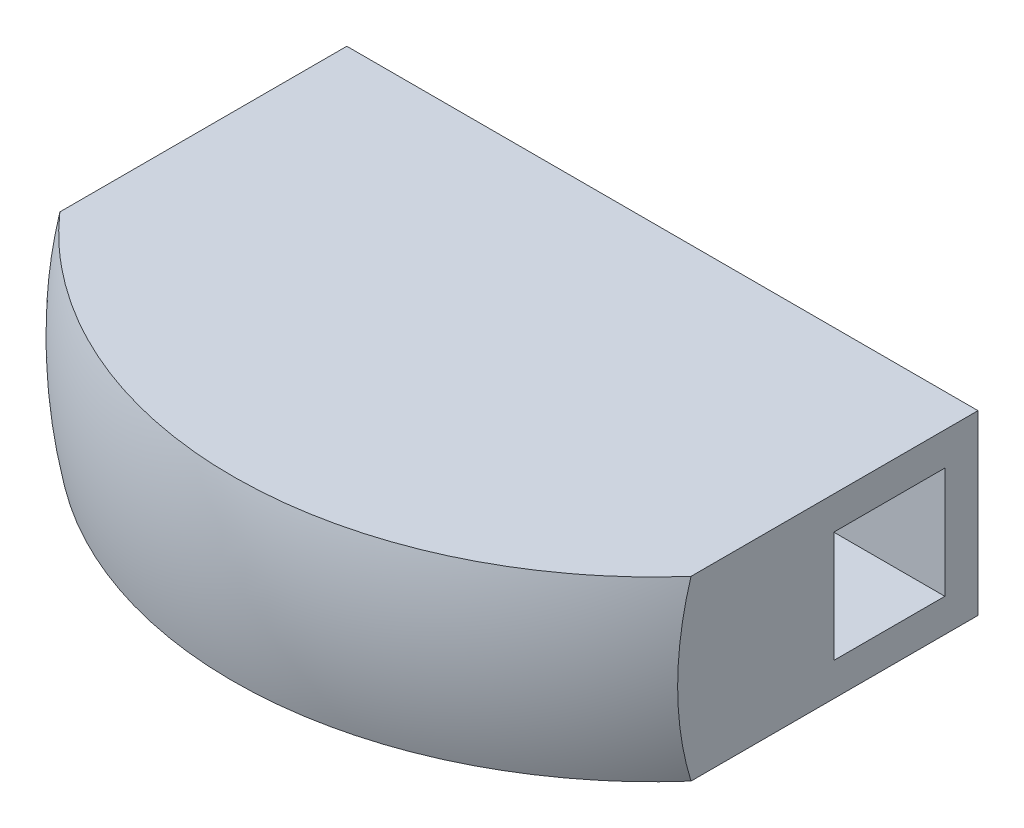
ISO-10303-21;
HEADER;
FILE_DESCRIPTION(('STEP AP214'),'2;1');
FILE_NAME('part.step','',(''),(''),'','','');
FILE_SCHEMA(('AUTOMOTIVE_DESIGN { 1 0 10303 214 1 1 1 1 }'));
ENDSEC;
DATA;
#1=APPLICATION_CONTEXT('core data for automotive mechanical design processes');
#2=APPLICATION_PROTOCOL_DEFINITION('international standard','automotive_design',2000,#1);
#3=PRODUCT_CONTEXT('',#1,'mechanical');
#4=PRODUCT('Part','Part','',(#3));
#5=PRODUCT_RELATED_PRODUCT_CATEGORY('part','',(#4));
#6=PRODUCT_DEFINITION_FORMATION('','',#4);
#7=PRODUCT_DEFINITION_CONTEXT('part definition',#1,'design');
#8=PRODUCT_DEFINITION('design','',#6,#7);
#9=PRODUCT_DEFINITION_SHAPE('','',#8);
#10=(LENGTH_UNIT() NAMED_UNIT(*) SI_UNIT(.MILLI.,.METRE.));
#11=(NAMED_UNIT(*) PLANE_ANGLE_UNIT() SI_UNIT($,.RADIAN.));
#12=(NAMED_UNIT(*) SI_UNIT($,.STERADIAN.) SOLID_ANGLE_UNIT());
#13=UNCERTAINTY_MEASURE_WITH_UNIT(LENGTH_MEASURE(1.E-05),#10,'distance_accuracy_value','');
#14=(GEOMETRIC_REPRESENTATION_CONTEXT(3) GLOBAL_UNCERTAINTY_ASSIGNED_CONTEXT((#13)) GLOBAL_UNIT_ASSIGNED_CONTEXT((#10,
#11,#12)) REPRESENTATION_CONTEXT('',''));
#15=CARTESIAN_POINT('',(0.,0.,0.));
#16=DIRECTION('',(0.,0.,1.));
#17=DIRECTION('',(1.,0.,0.));
#18=AXIS2_PLACEMENT_3D('',#15,#16,#17);
#19=CARTESIAN_POINT('',(9.525,0.,0.));
#20=DIRECTION('',(-1.,0.,0.));
#21=DIRECTION('',(0.,0.,1.));
#22=AXIS2_PLACEMENT_3D('',#19,#20,#21);
#23=PLANE('',#22);
#24=DIRECTION('',(0.,1.,0.));
#25=VECTOR('',#24,1.);
#26=CARTESIAN_POINT('',(9.525,-1.6764,-18.3231841816037));
#27=LINE('',#26,#25);
#28=CARTESIAN_POINT('',(9.525,-1.6764,-18.3231841816037));
#29=VERTEX_POINT('',#28);
#30=CARTESIAN_POINT('',(9.525,1.6764,-18.3231841816037));
#31=VERTEX_POINT('',#30);
#32=EDGE_CURVE('E197',#29,#31,#27,.T.);
#33=ORIENTED_EDGE('',*,*,#32,.F.);
#34=DIRECTION('',(0.,0.,-1.));
#35=VECTOR('',#34,1.);
#36=CARTESIAN_POINT('',(9.525,-1.6764,-14.9703841816037));
#37=LINE('',#36,#35);
#38=CARTESIAN_POINT('',(9.525,-1.6764,-14.9703841816037));
#39=VERTEX_POINT('',#38);
#40=EDGE_CURVE('E206',#39,#29,#37,.T.);
#41=ORIENTED_EDGE('',*,*,#40,.F.);
#42=DIRECTION('',(0.,-1.,0.));
#43=VECTOR('',#42,1.);
#44=CARTESIAN_POINT('',(9.525,-1.6764,-14.9703841816037));
#45=LINE('',#44,#43);
#46=CARTESIAN_POINT('',(9.525,1.6764,-14.9703841816037));
#47=VERTEX_POINT('',#46);
#48=EDGE_CURVE('E220',#47,#39,#45,.T.);
#49=ORIENTED_EDGE('',*,*,#48,.F.);
#50=DIRECTION('',(0.,0.,1.));
#51=VECTOR('',#50,1.);
#52=CARTESIAN_POINT('',(9.525,1.6764,-14.9703841816037));
#53=LINE('',#52,#51);
#54=EDGE_CURVE('E199',#31,#47,#53,.T.);
#55=ORIENTED_EDGE('',*,*,#54,.F.);
#56=EDGE_LOOP('',(#33,#41,#49,#55));
#57=FACE_BOUND('',#56,.T.);
#58=CARTESIAN_POINT('',(9.52500000000005,0.,-19.3231841816037));
#59=DIRECTION('',(1.,0.,0.));
#60=DIRECTION('',(0.,0.,-1.));
#61=AXIS2_PLACEMENT_3D('',#58,#59,#60);
#62=CIRCLE('',#61,9.06509971074134);
#63=CARTESIAN_POINT('',(9.52500000000005,2.6764,-10.662184481472));
#64=VERTEX_POINT('',#63);
#65=CARTESIAN_POINT('',(9.52500000000005,-2.6764,-10.662184481472));
#66=VERTEX_POINT('',#65);
#67=EDGE_CURVE('E105',#64,#66,#62,.T.);
#68=ORIENTED_EDGE('',*,*,#67,.T.);
#69=DIRECTION('',(0.,0.,-1.));
#70=VECTOR('',#69,1.);
#71=CARTESIAN_POINT('',(9.525,-2.6764,-13.9703841816037));
#72=LINE('',#71,#70);
#73=CARTESIAN_POINT('',(9.525,-2.6764,-19.3231841816037));
#74=VERTEX_POINT('',#73);
#75=EDGE_CURVE('E128',#66,#74,#72,.T.);
#76=ORIENTED_EDGE('',*,*,#75,.T.);
#77=DIRECTION('',(0.,1.,0.));
#78=VECTOR('',#77,1.);
#79=CARTESIAN_POINT('',(9.525,-2.6764,-19.3231841816037));
#80=LINE('',#79,#78);
#81=CARTESIAN_POINT('',(9.525,2.6764,-19.3231841816037));
#82=VERTEX_POINT('',#81);
#83=EDGE_CURVE('E125',#74,#82,#80,.T.);
#84=ORIENTED_EDGE('',*,*,#83,.T.);
#85=DIRECTION('',(0.,0.,1.));
#86=VECTOR('',#85,1.);
#87=CARTESIAN_POINT('',(9.525,2.6764,-13.9703841816037));
#88=LINE('',#87,#86);
#89=EDGE_CURVE('E118',#82,#64,#88,.T.);
#90=ORIENTED_EDGE('',*,*,#89,.T.);
#91=EDGE_LOOP('',(#68,#76,#84,#90));
#92=FACE_BOUND('',#91,.T.);
#93=ADVANCED_FACE('F40',(#57,#92),#23,.F.);
#94=CARTESIAN_POINT('',(-9.525,0.,0.));
#95=DIRECTION('',(-1.,0.,0.));
#96=DIRECTION('',(0.,0.,1.));
#97=AXIS2_PLACEMENT_3D('',#94,#95,#96);
#98=PLANE('',#97);
#99=DIRECTION('',(0.,0.,-1.));
#100=VECTOR('',#99,1.);
#101=CARTESIAN_POINT('',(-9.525,-1.6764,-14.9703841816037));
#102=LINE('',#101,#100);
#103=CARTESIAN_POINT('',(-9.525,-1.6764,-14.9703841816037));
#104=VERTEX_POINT('',#103);
#105=CARTESIAN_POINT('',(-9.525,-1.6764,-18.3231841816037));
#106=VERTEX_POINT('',#105);
#107=EDGE_CURVE('E192',#104,#106,#102,.T.);
#108=ORIENTED_EDGE('',*,*,#107,.T.);
#109=DIRECTION('',(0.,1.,0.));
#110=VECTOR('',#109,1.);
#111=CARTESIAN_POINT('',(-9.525,-1.6764,-18.3231841816037));
#112=LINE('',#111,#110);
#113=CARTESIAN_POINT('',(-9.525,1.6764,-18.3231841816037));
#114=VERTEX_POINT('',#113);
#115=EDGE_CURVE('E122',#106,#114,#112,.T.);
#116=ORIENTED_EDGE('',*,*,#115,.T.);
#117=DIRECTION('',(0.,0.,1.));
#118=VECTOR('',#117,1.);
#119=CARTESIAN_POINT('',(-9.525,1.6764,-14.9703841816037));
#120=LINE('',#119,#118);
#121=CARTESIAN_POINT('',(-9.525,1.6764,-14.9703841816037));
#122=VERTEX_POINT('',#121);
#123=EDGE_CURVE('E200',#114,#122,#120,.T.);
#124=ORIENTED_EDGE('',*,*,#123,.T.);
#125=DIRECTION('',(0.,-1.,0.));
#126=VECTOR('',#125,1.);
#127=CARTESIAN_POINT('',(-9.525,-1.6764,-14.9703841816037));
#128=LINE('',#127,#126);
#129=EDGE_CURVE('E195',#122,#104,#128,.T.);
#130=ORIENTED_EDGE('',*,*,#129,.T.);
#131=EDGE_LOOP('',(#108,#116,#124,#130));
#132=FACE_BOUND('',#131,.T.);
#133=DIRECTION('',(0.,0.,-1.));
#134=VECTOR('',#133,1.);
#135=CARTESIAN_POINT('',(-9.525,-2.6764,-13.9703841816037));
#136=LINE('',#135,#134);
#137=CARTESIAN_POINT('',(-9.525,-2.6764,-10.662184481472));
#138=VERTEX_POINT('',#137);
#139=CARTESIAN_POINT('',(-9.525,-2.6764,-19.3231841816037));
#140=VERTEX_POINT('',#139);
#141=EDGE_CURVE('E131',#138,#140,#136,.T.);
#142=ORIENTED_EDGE('',*,*,#141,.F.);
#143=CARTESIAN_POINT('',(-9.525,0.,-19.3231841816037));
#144=DIRECTION('',(1.,0.,0.));
#145=DIRECTION('',(0.,0.,-1.));
#146=AXIS2_PLACEMENT_3D('',#143,#144,#145);
#147=CIRCLE('',#146,9.06509971074129);
#148=CARTESIAN_POINT('',(-9.525,2.6764,-10.662184481472));
#149=VERTEX_POINT('',#148);
#150=EDGE_CURVE('E56',#149,#138,#147,.T.);
#151=ORIENTED_EDGE('',*,*,#150,.F.);
#152=DIRECTION('',(0.,0.,1.));
#153=VECTOR('',#152,1.);
#154=CARTESIAN_POINT('',(-9.525,2.6764,-13.9703841816037));
#155=LINE('',#154,#153);
#156=CARTESIAN_POINT('',(-9.525,2.6764,-19.3231841816037));
#157=VERTEX_POINT('',#156);
#158=EDGE_CURVE('E120',#157,#149,#155,.T.);
#159=ORIENTED_EDGE('',*,*,#158,.F.);
#160=DIRECTION('',(0.,1.,0.));
#161=VECTOR('',#160,1.);
#162=CARTESIAN_POINT('',(-9.525,-2.6764,-19.3231841816037));
#163=LINE('',#162,#161);
#164=EDGE_CURVE('E135',#140,#157,#163,.T.);
#165=ORIENTED_EDGE('',*,*,#164,.F.);
#166=EDGE_LOOP('',(#142,#151,#159,#165));
#167=FACE_BOUND('',#166,.T.);
#168=ADVANCED_FACE('F147',(#132,#167),#98,.T.);
#169=CARTESIAN_POINT('',(9.525,2.6764,-13.9703841816037));
#170=DIRECTION('',(0.,-1.,0.));
#171=DIRECTION('',(0.,0.,-1.));
#172=AXIS2_PLACEMENT_3D('',#169,#170,#171);
#173=PLANE('',#172);
#174=CARTESIAN_POINT('',(0.,2.6764,-6.36104111276134));
#175=CARTESIAN_POINT('',(-0.356706333382032,2.6764,-6.36103872818584));
#176=CARTESIAN_POINT('',(-0.713373150810532,2.6764,-6.37608215313004));
#177=CARTESIAN_POINT('',(-1.42429061634147,2.6764,-6.4361511177358));
#178=CARTESIAN_POINT('',(-1.77854059003128,2.6764,-6.48118470603078));
#179=CARTESIAN_POINT('',(-2.48236242821483,2.6764,-6.60098853238488));
#180=CARTESIAN_POINT('',(-2.83192885646612,2.6764,-6.67579067383034));
#181=CARTESIAN_POINT('',(-3.52351211620094,2.6764,-6.85459606469783));
#182=CARTESIAN_POINT('',(-3.86552897207856,2.6764,-6.95859921975101));
#183=CARTESIAN_POINT('',(-4.53940025423462,2.6764,-7.19500195253934));
#184=CARTESIAN_POINT('',(-4.87125995322903,2.6764,-7.32738650127374));
#185=CARTESIAN_POINT('',(-5.52265328839015,2.6764,-7.61964270043446));
#186=CARTESIAN_POINT('',(-5.84218672530932,2.6764,-7.77951479495472));
#187=CARTESIAN_POINT('',(-6.46659182412106,2.6764,-8.12557080816826));
#188=CARTESIAN_POINT('',(-6.77146631330618,2.6764,-8.31174962554084));
#189=CARTESIAN_POINT('',(-7.36445613252581,2.6764,-8.70911407130641));
#190=CARTESIAN_POINT('',(-7.65257153119491,2.6764,-8.92029959727703));
#191=CARTESIAN_POINT('',(-8.21012053577098,2.6764,-9.36626536968758));
#192=CARTESIAN_POINT('',(-8.47954628234231,2.6764,-9.60105544182838));
#193=CARTESIAN_POINT('',(-8.99767868061575,2.6764,-10.0924811133529));
#194=CARTESIAN_POINT('',(-9.24638528965822,2.6764,-10.3491167577133));
#195=CARTESIAN_POINT('',(-9.72130055731956,2.6764,-10.882371497116));
#196=CARTESIAN_POINT('',(-9.94751167886084,2.6764,-11.1589883987693));
#197=CARTESIAN_POINT('',(-10.375883201018,2.6764,-11.7302537567562));
#198=CARTESIAN_POINT('',(-10.5780437077841,2.6764,-12.0249021334972));
#199=CARTESIAN_POINT('',(-10.9571887990091,2.6764,-12.6305585776318));
#200=CARTESIAN_POINT('',(-11.1341370866067,2.6764,-12.9415893656884));
#201=CARTESIAN_POINT('',(-11.461322131228,2.6764,-13.5773990027897));
#202=CARTESIAN_POINT('',(-11.6115585425688,2.6764,-13.9021780296852));
#203=CARTESIAN_POINT('',(-11.8843559032174,2.6764,-14.5631404319725));
#204=CARTESIAN_POINT('',(-12.0069178535686,2.6764,-14.8993233943539));
#205=CARTESIAN_POINT('',(-12.2237103749526,2.6764,-15.5807059038862));
#206=CARTESIAN_POINT('',(-12.3179401001963,2.6764,-15.925905719879));
#207=CARTESIAN_POINT('',(-12.4784050865298,2.6764,-16.6255549452115));
#208=CARTESIAN_POINT('',(-12.5444179205944,2.6764,-16.9800552802042));
#209=CARTESIAN_POINT('',(-12.6476759146373,2.6764,-17.6932273821081));
#210=CARTESIAN_POINT('',(-12.6849182040585,2.6764,-18.0518995616388));
#211=CARTESIAN_POINT('',(-12.7315680333562,2.6764,-18.7712740153442));
#212=CARTESIAN_POINT('',(-12.7409564713215,2.6764,-19.1319775128086));
#213=CARTESIAN_POINT('',(-12.7323400084604,2.6764,-19.8530515751991));
#214=CARTESIAN_POINT('',(-12.7143344850049,2.6764,-20.2134221323716));
#215=CARTESIAN_POINT('',(-12.647713272892,2.6764,-20.9582627789949));
#216=CARTESIAN_POINT('',(-12.5969358183203,2.6764,-21.3425478426158));
#217=CARTESIAN_POINT('',(-12.4957061325001,2.6764,-21.9144089805061));
#218=CARTESIAN_POINT('',(-12.4577838864939,2.6764,-22.1042748518557));
#219=CARTESIAN_POINT('',(-12.373555068229,2.6764,-22.4821983668385));
#220=CARTESIAN_POINT('',(-12.3272459930399,2.6764,-22.6702554529737));
#221=CARTESIAN_POINT('',(-12.1758638536321,2.6764,-23.2306542754843));
#222=CARTESIAN_POINT('',(-12.0582540585115,2.6764,-23.5996876171884));
#223=CARTESIAN_POINT('',(-11.7902119681965,2.6764,-24.3256310667531));
#224=CARTESIAN_POINT('',(-11.6397811494156,2.6764,-24.6825417191038));
#225=CARTESIAN_POINT('',(-11.3943958298017,2.6764,-25.1980784422624));
#226=CARTESIAN_POINT('',(-11.3116714769368,2.6764,-25.3626150558374));
#227=CARTESIAN_POINT('',(-11.1392116324548,2.6764,-25.6879126393321));
#228=CARTESIAN_POINT('',(-11.0494781222374,2.6764,-25.8486746596882));
#229=CARTESIAN_POINT('',(-10.7699473205312,2.6764,-26.3249213569584));
#230=CARTESIAN_POINT('',(-10.5697977499599,2.6764,-26.6344129041954));
#231=CARTESIAN_POINT('',(-10.1433884349104,2.6764,-27.2349538335095));
#232=CARTESIAN_POINT('',(-9.91711956014181,2.6764,-27.5259967112422));
#233=CARTESIAN_POINT('',(-9.44017694873297,2.6764,-28.0873672476404));
#234=CARTESIAN_POINT('',(-9.18950336330568,2.6764,-28.3576950346392));
#235=CARTESIAN_POINT('',(-8.67281065669018,2.6764,-28.8684762707098));
#236=CARTESIAN_POINT('',(-8.40739889693599,2.6764,-29.1095446503345));
#237=CARTESIAN_POINT('',(-7.85716357689281,2.6764,-29.568396378549));
#238=CARTESIAN_POINT('',(-7.57234048242134,2.6764,-29.7861802855789));
#239=CARTESIAN_POINT('',(-6.98537741894375,2.6764,-30.1968547994089));
#240=CARTESIAN_POINT('',(-6.68324138123146,2.6764,-30.3897510254234));
#241=CARTESIAN_POINT('',(-6.06374869201912,2.6764,-30.7493248204919));
#242=CARTESIAN_POINT('',(-5.74639198010835,2.6764,-30.9160022854725));
#243=CARTESIAN_POINT('',(-5.0996209515512,2.6764,-31.2215188397575));
#244=CARTESIAN_POINT('',(-4.77024226780797,2.6764,-31.3604333693403));
#245=CARTESIAN_POINT('',(-4.10094892106144,2.6764,-31.6100050554441));
#246=CARTESIAN_POINT('',(-3.7610342927456,2.6764,-31.7206623049853));
#247=CARTESIAN_POINT('',(-3.07306673303707,2.6764,-31.9129355910678));
#248=CARTESIAN_POINT('',(-2.7250133227663,2.6764,-31.9945499141459));
#249=CARTESIAN_POINT('',(-2.02326485887464,2.6764,-32.1281456848067));
#250=CARTESIAN_POINT('',(-1.66956980289795,2.6764,-32.1801271200152));
#251=CARTESIAN_POINT('',(-0.959287797268277,2.6764,-32.2540619166436));
#252=CARTESIAN_POINT('',(-0.602702878178728,2.6764,-32.2760347868309));
#253=CARTESIAN_POINT('',(0.111050190619216,2.6764,-32.2898589306423));
#254=CARTESIAN_POINT('',(0.46821833993321,2.6764,-32.281710224627));
#255=CARTESIAN_POINT('',(1.18059334887869,2.6764,-32.2353496496098));
#256=CARTESIAN_POINT('',(1.53580023463533,2.6764,-32.1971381820387));
#257=CARTESIAN_POINT('',(2.24173183504406,2.6764,-32.090924989817));
#258=CARTESIAN_POINT('',(2.59245654932234,2.6764,-32.0229232626819));
#259=CARTESIAN_POINT('',(3.28689700947189,2.6764,-31.8576222649077));
#260=CARTESIAN_POINT('',(3.63061342165572,2.6764,-31.7603257934577));
#261=CARTESIAN_POINT('',(4.30862909324382,2.6764,-31.5371265720649));
#262=CARTESIAN_POINT('',(4.6429283540155,2.6764,-31.4112238262758));
#263=CARTESIAN_POINT('',(5.29972803989023,2.6764,-31.1317124661569));
#264=CARTESIAN_POINT('',(5.62222871005833,2.6764,-30.9781044276789));
#265=CARTESIAN_POINT('',(6.25314881827253,2.6764,-30.6442757845478));
#266=CARTESIAN_POINT('',(6.56156825578425,2.6764,-30.4640551788846));
#267=CARTESIAN_POINT('',(7.16219072596526,2.6764,-30.0782523996967));
#268=CARTESIAN_POINT('',(7.45439090348409,2.6764,-29.8726657812759));
#269=CARTESIAN_POINT('',(8.02044547968661,2.6764,-29.43762241604));
#270=CARTESIAN_POINT('',(8.29429987587887,2.6764,-29.2081656659833));
#271=CARTESIAN_POINT('',(8.82175404973172,2.6764,-28.7269933839741));
#272=CARTESIAN_POINT('',(9.07535166793604,2.6764,-28.4752754849022));
#273=CARTESIAN_POINT('',(9.56047179298946,2.6764,-27.9513985329787));
#274=CARTESIAN_POINT('',(9.79199429769442,2.6764,-27.6792394781416));
#275=CARTESIAN_POINT('',(10.2315812283992,2.6764,-27.116115985064));
#276=CARTESIAN_POINT('',(10.4396197928613,2.6764,-26.8251313592661));
#277=CARTESIAN_POINT('',(10.8305015708918,2.6764,-26.2267065030885));
#278=CARTESIAN_POINT('',(11.0133447862198,2.6764,-25.9192662738578));
#279=CARTESIAN_POINT('',(11.3525093106985,2.6764,-25.2902864425915));
#280=CARTESIAN_POINT('',(11.5088436169609,2.6764,-24.9687538478182));
#281=CARTESIAN_POINT('',(11.7940898191351,2.6764,-24.3137453971172));
#282=CARTESIAN_POINT('',(11.9230013367574,2.6764,-23.9802693765076));
#283=CARTESIAN_POINT('',(12.1530973312692,2.6764,-23.3024788428095));
#284=CARTESIAN_POINT('',(12.2541747692729,2.6764,-22.9581280124757));
#285=CARTESIAN_POINT('',(12.4275668803436,2.6764,-22.2622876714202));
#286=CARTESIAN_POINT('',(12.4998827334332,2.6764,-21.9107984541923));
#287=CARTESIAN_POINT('',(12.6159517039982,2.6764,-21.2027868070383));
#288=CARTESIAN_POINT('',(12.6596754055068,2.6764,-20.8462595778631));
#289=CARTESIAN_POINT('',(12.7192504808633,2.6764,-20.1308578371626));
#290=CARTESIAN_POINT('',(12.7350970851763,2.6764,-19.7719829345106));
#291=CARTESIAN_POINT('',(12.7397655402384,2.6764,-19.0361641568841));
#292=CARTESIAN_POINT('',(12.7272016586345,2.6764,-18.6592108417558));
#293=CARTESIAN_POINT('',(12.671481584788,2.6764,-17.9075819779678));
#294=CARTESIAN_POINT('',(12.6283287070747,2.6764,-17.5329061869586));
#295=CARTESIAN_POINT('',(12.5104804412113,2.6764,-16.7888152924904));
#296=CARTESIAN_POINT('',(12.435809651021,2.6764,-16.4193963183013));
#297=CARTESIAN_POINT('',(12.2547441069672,2.6764,-15.6883941508112));
#298=CARTESIAN_POINT('',(12.1483487171463,2.6764,-15.3268111147469));
#299=CARTESIAN_POINT('',(11.9035733096457,2.6764,-14.6122871949524));
#300=CARTESIAN_POINT('',(11.7650117162076,2.6764,-14.2594084508283));
#301=CARTESIAN_POINT('',(11.4571488138705,2.6764,-13.5673166294958));
#302=CARTESIAN_POINT('',(11.2878472050037,2.6764,-13.2281036856807));
#303=CARTESIAN_POINT('',(10.9196926389127,2.6764,-12.5659752514134));
#304=CARTESIAN_POINT('',(10.7208306728008,2.6764,-12.2430647696715));
#305=CARTESIAN_POINT('',(10.2951260639177,2.6764,-11.6162606428946));
#306=CARTESIAN_POINT('',(10.0682847733905,2.6764,-11.3123660798873));
#307=CARTESIAN_POINT('',(9.60082921842276,2.6764,-10.7412135406791));
#308=CARTESIAN_POINT('',(9.36153539593579,2.6764,-10.4728734425634));
#309=CARTESIAN_POINT('',(8.86109112067387,2.6764,-9.9574170839557));
#310=CARTESIAN_POINT('',(8.59994118905794,2.6764,-9.71030031767774));
#311=CARTESIAN_POINT('',(8.0576436325909,2.6764,-9.23906940870085));
#312=CARTESIAN_POINT('',(7.77649554362219,2.6764,-9.01495580015472));
#313=CARTESIAN_POINT('',(7.19622396460476,2.6764,-8.59135736767941));
#314=CARTESIAN_POINT('',(6.89710066935972,2.6764,-8.39187227691379));
#315=CARTESIAN_POINT('',(6.28445402059024,2.6764,-8.01983775767871));
#316=CARTESIAN_POINT('',(5.97100413954553,2.6764,-7.84716732691717));
#317=CARTESIAN_POINT('',(5.33066139991338,2.6764,-7.52889003788554));
#318=CARTESIAN_POINT('',(5.00376880799119,2.6764,-7.38328264307761));
#319=CARTESIAN_POINT('',(4.33921061412081,2.6764,-7.12030810149111));
#320=CARTESIAN_POINT('',(4.00155679759373,2.6764,-7.00291118673825));
#321=CARTESIAN_POINT('',(3.3176678050129,2.6764,-6.797026782858));
#322=CARTESIAN_POINT('',(2.97143495457773,2.6764,-6.70853154929237));
#323=CARTESIAN_POINT('',(2.19140295668614,2.6764,-6.54387503947231));
#324=CARTESIAN_POINT('',(1.75596678381787,2.6764,-6.47536956265611));
#325=CARTESIAN_POINT('',(0.880333689331925,2.6764,-6.38395404978891));
#326=CARTESIAN_POINT('',(0.440136763399238,2.6764,-6.36104405506779));
#327=CARTESIAN_POINT('',(0.,2.6764,-6.36104111276134));
#328=B_SPLINE_CURVE_WITH_KNOTS('',3,(#174,#175,#176,#177,#178,#179,#180,#181,#182,#183,#184,
#185,#186,#187,#188,#189,#190,#191,#192,#193,#194,#195,#196,#197,#198,#199,#200,#201,#202,#203,
#204,#205,#206,#207,#208,#209,#210,#211,#212,#213,#214,#215,#216,#217,#218,#219,#220,#221,#222,
#223,#224,#225,#226,#227,#228,#229,#230,#231,#232,#233,#234,#235,#236,#237,#238,#239,#240,#241,
#242,#243,#244,#245,#246,#247,#248,#249,#250,#251,#252,#253,#254,#255,#256,#257,#258,#259,#260,
#261,#262,#263,#264,#265,#266,#267,#268,#269,#270,#271,#272,#273,#274,#275,#276,#277,#278,#279,
#280,#281,#282,#283,#284,#285,#286,#287,#288,#289,#290,#291,#292,#293,#294,#295,#296,#297,#298,
#299,#300,#301,#302,#303,#304,#305,#306,#307,#308,#309,#310,#311,#312,#313,#314,#315,#316,#317,
#318,#319,#320,#321,#322,#323,#324,#325,#326,#327),.UNSPECIFIED.,.T.,.F.,(4,2,2,2,2,2,2,2,2,2,2,
2,2,2,2,2,2,2,2,2,2,2,2,2,2,2,2,2,2,2,2,2,2,2,2,2,2,2,2,2,2,2,2,2,2,2,2,2,2,2,2,2,2,2,2,2,2,2,2,
2,2,2,2,2,2,2,2,2,2,2,2,2,2,2,2,2,4),(0.,1.06973410093253,2.13975540834555,3.21092657458038,
4.28209427915353,5.35269615559699,6.42331533051028,7.49372717836927,8.5641346421926,
9.63498953665158,10.7058466358907,11.7765863627721,12.8473213636411,13.9195826051001,
14.9918577218613,16.0640940459641,17.1363623758741,18.216933877804,19.2976131789343,
20.3790334287228,21.4604782581557,22.6217647342057,23.2024486396585,23.7833061284325,
24.9436126466682,26.1038669806928,26.6562043021947,27.2083860461317,28.3125964389864,
29.4171939963198,30.5217847099405,31.5961591068048,32.6705077307725,33.7446133590401,
34.8187232507762,35.8898735452378,36.9610203135302,38.0322302664454,39.1034406666782,
40.1739543338802,41.2444672774661,42.314965926634,43.3854646650764,44.4558611470185,
45.5262574735345,46.5966315545273,47.6670056761393,48.737567626904,49.8081297230545,
50.8788057936585,51.9494819682555,53.021325946603,54.0931698501026,55.1644867077711,
56.2358183429902,57.3112141209424,58.386565773291,59.4630220276597,60.5396624366578,
61.6699421000985,62.8000993086383,63.929376119089,65.0586755687587,66.1945118838969,
67.3303592833693,68.4665535589325,69.6026929435947,70.6800311556832,71.757343685953,
72.8346812266753,73.9120070940137,74.9843206113038,76.0566128671888,77.1277686116833,
78.1986370954229,79.5185712654641,80.8385066319553),.UNSPECIFIED.);
#329=EDGE_CURVE('E108',#64,#149,#328,.T.);
#330=ORIENTED_EDGE('',*,*,#329,.F.);
#331=ORIENTED_EDGE('',*,*,#89,.F.);
#332=DIRECTION('',(-1.,0.,0.));
#333=VECTOR('',#332,1.);
#334=CARTESIAN_POINT('',(9.525,2.6764,-19.3231841816037));
#335=LINE('',#334,#333);
#336=EDGE_CURVE('E11',#82,#157,#335,.T.);
#337=ORIENTED_EDGE('',*,*,#336,.T.);
#338=ORIENTED_EDGE('',*,*,#158,.T.);
#339=EDGE_LOOP('',(#330,#331,#337,#338));
#340=FACE_BOUND('',#339,.T.);
#341=ADVANCED_FACE('F117',(#340),#173,.F.);
#342=CARTESIAN_POINT('',(9.525,-2.6764,-13.9703841816037));
#343=DIRECTION('',(0.,1.,0.));
#344=DIRECTION('',(0.,0.,1.));
#345=AXIS2_PLACEMENT_3D('',#342,#343,#344);
#346=PLANE('',#345);
#347=CARTESIAN_POINT('',(0.,-2.6764,-6.36104111276134));
#348=CARTESIAN_POINT('',(0.35670633338196,-2.6764,-6.36103872818583));
#349=CARTESIAN_POINT('',(0.713373150810461,-2.6764,-6.37608215313003));
#350=CARTESIAN_POINT('',(1.4242906163414,-2.6764,-6.43615111773577));
#351=CARTESIAN_POINT('',(1.77854059003121,-2.6764,-6.48118470603075));
#352=CARTESIAN_POINT('',(2.48236242821476,-2.6764,-6.60098853238484));
#353=CARTESIAN_POINT('',(2.83192885646605,-2.6764,-6.6757906738303));
#354=CARTESIAN_POINT('',(3.52351211620088,-2.6764,-6.85459606469777));
#355=CARTESIAN_POINT('',(3.8655289720785,-2.6764,-6.95859921975094));
#356=CARTESIAN_POINT('',(4.53940025423456,-2.6764,-7.19500195253927));
#357=CARTESIAN_POINT('',(4.87125995322898,-2.6764,-7.32738650127366));
#358=CARTESIAN_POINT('',(5.5226532883901,-2.6764,-7.61964270043437));
#359=CARTESIAN_POINT('',(5.84218672530927,-2.6764,-7.77951479495463));
#360=CARTESIAN_POINT('',(6.46659182412102,-2.6764,-8.12557080816815));
#361=CARTESIAN_POINT('',(6.77146631330614,-2.6764,-8.31174962554074));
#362=CARTESIAN_POINT('',(7.36445613252577,-2.6764,-8.70911407130629));
#363=CARTESIAN_POINT('',(7.65257153119488,-2.6764,-8.92029959727691));
#364=CARTESIAN_POINT('',(8.21012053577095,-2.6764,-9.36626536968745));
#365=CARTESIAN_POINT('',(8.47954628234229,-2.6764,-9.60105544182825));
#366=CARTESIAN_POINT('',(8.99767868061573,-2.6764,-10.0924811133527));
#367=CARTESIAN_POINT('',(9.24638528965821,-2.6764,-10.3491167577132));
#368=CARTESIAN_POINT('',(9.72130055731956,-2.6764,-10.8823714971159));
#369=CARTESIAN_POINT('',(9.94751167886085,-2.6764,-11.1589883987691));
#370=CARTESIAN_POINT('',(10.375883201018,-2.6764,-11.7302537567561));
#371=CARTESIAN_POINT('',(10.5780437077842,-2.6764,-12.024902133497));
#372=CARTESIAN_POINT('',(10.9571887990091,-2.6764,-12.6305585776316));
#373=CARTESIAN_POINT('',(11.1341370866067,-2.6764,-12.9415893656882));
#374=CARTESIAN_POINT('',(11.461322131228,-2.6764,-13.5773990027895));
#375=CARTESIAN_POINT('',(11.6115585425688,-2.6764,-13.902178029685));
#376=CARTESIAN_POINT('',(11.8843559032174,-2.6764,-14.5631404319723));
#377=CARTESIAN_POINT('',(12.0069178535686,-2.6764,-14.8993233943537));
#378=CARTESIAN_POINT('',(12.2237103749526,-2.6764,-15.580705903886));
#379=CARTESIAN_POINT('',(12.3179401001964,-2.6764,-15.9259057198788));
#380=CARTESIAN_POINT('',(12.4784050865299,-2.6764,-16.6255549452113));
#381=CARTESIAN_POINT('',(12.5444179205945,-2.6764,-16.980055280204));
#382=CARTESIAN_POINT('',(12.6476759146374,-2.6764,-17.6932273821079));
#383=CARTESIAN_POINT('',(12.6849182040586,-2.6764,-18.0518995616386));
#384=CARTESIAN_POINT('',(12.7315680333564,-2.6764,-18.771274015344));
#385=CARTESIAN_POINT('',(12.7409564713216,-2.6764,-19.1319775128084));
#386=CARTESIAN_POINT('',(12.7323400084605,-2.6764,-19.8530515751989));
#387=CARTESIAN_POINT('',(12.714334485005,-2.6764,-20.2134221323714));
#388=CARTESIAN_POINT('',(12.6477132728921,-2.6764,-20.9582627789947));
#389=CARTESIAN_POINT('',(12.5969358183205,-2.6764,-21.3425478426156));
#390=CARTESIAN_POINT('',(12.4957061325003,-2.6764,-21.9144089805059));
#391=CARTESIAN_POINT('',(12.4577838864941,-2.6764,-22.1042748518555));
#392=CARTESIAN_POINT('',(12.3735550682292,-2.6764,-22.4821983668383));
#393=CARTESIAN_POINT('',(12.3272459930401,-2.6764,-22.6702554529735));
#394=CARTESIAN_POINT('',(12.1758638536323,-2.6764,-23.2306542754841));
#395=CARTESIAN_POINT('',(12.0582540585117,-2.6764,-23.5996876171881));
#396=CARTESIAN_POINT('',(11.7902119681967,-2.6764,-24.3256310667529));
#397=CARTESIAN_POINT('',(11.6397811494159,-2.6764,-24.6825417191036));
#398=CARTESIAN_POINT('',(11.3943958298019,-2.6764,-25.1980784422622));
#399=CARTESIAN_POINT('',(11.311671476937,-2.6764,-25.3626150558372));
#400=CARTESIAN_POINT('',(11.139211632455,-2.6764,-25.6879126393319));
#401=CARTESIAN_POINT('',(11.0494781222376,-2.6764,-25.848674659688));
#402=CARTESIAN_POINT('',(10.7699473205315,-2.6764,-26.3249213569582));
#403=CARTESIAN_POINT('',(10.5697977499602,-2.6764,-26.6344129041952));
#404=CARTESIAN_POINT('',(10.1433884349107,-2.6764,-27.2349538335093));
#405=CARTESIAN_POINT('',(9.91711956014208,-2.6764,-27.525996711242));
#406=CARTESIAN_POINT('',(9.44017694873325,-2.6764,-28.0873672476402));
#407=CARTESIAN_POINT('',(9.18950336330596,-2.6764,-28.357695034639));
#408=CARTESIAN_POINT('',(8.67281065669047,-2.6764,-28.8684762707097));
#409=CARTESIAN_POINT('',(8.40739889693628,-2.6764,-29.1095446503344));
#410=CARTESIAN_POINT('',(7.8571635768931,-2.6764,-29.5683963785489));
#411=CARTESIAN_POINT('',(7.57234048242164,-2.6764,-29.7861802855788));
#412=CARTESIAN_POINT('',(6.98537741894406,-2.6764,-30.1968547994088));
#413=CARTESIAN_POINT('',(6.68324138123177,-2.6764,-30.3897510254233));
#414=CARTESIAN_POINT('',(6.06374869201944,-2.6764,-30.7493248204918));
#415=CARTESIAN_POINT('',(5.74639198010867,-2.6764,-30.9160022854724));
#416=CARTESIAN_POINT('',(5.09962095155153,-2.6764,-31.2215188397574));
#417=CARTESIAN_POINT('',(4.7702422678083,-2.6764,-31.3604333693402));
#418=CARTESIAN_POINT('',(4.10094892106178,-2.6764,-31.610005055444));
#419=CARTESIAN_POINT('',(3.76103429274594,-2.6764,-31.7206623049852));
#420=CARTESIAN_POINT('',(3.0730667330374,-2.6764,-31.9129355910677));
#421=CARTESIAN_POINT('',(2.72501332276664,-2.6764,-31.9945499141459));
#422=CARTESIAN_POINT('',(2.02326485887498,-2.6764,-32.1281456848067));
#423=CARTESIAN_POINT('',(1.6695698028983,-2.6764,-32.1801271200152));
#424=CARTESIAN_POINT('',(0.959287797268622,-2.6764,-32.2540619166436));
#425=CARTESIAN_POINT('',(0.602702878179072,-2.6764,-32.2760347868309));
#426=CARTESIAN_POINT('',(-0.111050190618871,-2.6764,-32.2898589306423));
#427=CARTESIAN_POINT('',(-0.468218339932865,-2.6764,-32.281710224627));
#428=CARTESIAN_POINT('',(-1.18059334887835,-2.6764,-32.2353496496098));
#429=CARTESIAN_POINT('',(-1.53580023463499,-2.6764,-32.1971381820388));
#430=CARTESIAN_POINT('',(-2.24173183504372,-2.6764,-32.090924989817));
#431=CARTESIAN_POINT('',(-2.59245654932201,-2.6764,-32.022923262682));
#432=CARTESIAN_POINT('',(-3.28689700947155,-2.6764,-31.8576222649078));
#433=CARTESIAN_POINT('',(-3.63061342165539,-2.6764,-31.7603257934578));
#434=CARTESIAN_POINT('',(-4.30862909324349,-2.6764,-31.537126572065));
#435=CARTESIAN_POINT('',(-4.64292835401517,-2.6764,-31.4112238262759));
#436=CARTESIAN_POINT('',(-5.29972803988991,-2.6764,-31.131712466157));
#437=CARTESIAN_POINT('',(-5.62222871005801,-2.6764,-30.978104427679));
#438=CARTESIAN_POINT('',(-6.25314881827221,-2.6764,-30.6442757845479));
#439=CARTESIAN_POINT('',(-6.56156825578394,-2.6764,-30.4640551788847));
#440=CARTESIAN_POINT('',(-7.16219072596496,-2.6764,-30.0782523996968));
#441=CARTESIAN_POINT('',(-7.45439090348379,-2.6764,-29.872665781276));
#442=CARTESIAN_POINT('',(-8.02044547968631,-2.6764,-29.4376224160401));
#443=CARTESIAN_POINT('',(-8.29429987587858,-2.6764,-29.2081656659835));
#444=CARTESIAN_POINT('',(-8.82175404973143,-2.6764,-28.7269933839743));
#445=CARTESIAN_POINT('',(-9.07535166793576,-2.6764,-28.4752754849024));
#446=CARTESIAN_POINT('',(-9.56047179298918,-2.6764,-27.9513985329788));
#447=CARTESIAN_POINT('',(-9.79199429769416,-2.6764,-27.6792394781417));
#448=CARTESIAN_POINT('',(-10.2315812283989,-2.6764,-27.1161159850642));
#449=CARTESIAN_POINT('',(-10.439619792861,-2.6764,-26.8251313592663));
#450=CARTESIAN_POINT('',(-10.8305015708916,-2.6764,-26.2267065030886));
#451=CARTESIAN_POINT('',(-11.0133447862195,-2.6764,-25.919266273858));
#452=CARTESIAN_POINT('',(-11.3525093106983,-2.6764,-25.2902864425917));
#453=CARTESIAN_POINT('',(-11.5088436169607,-2.6764,-24.9687538478184));
#454=CARTESIAN_POINT('',(-11.7940898191349,-2.6764,-24.3137453971174));
#455=CARTESIAN_POINT('',(-11.9230013367572,-2.6764,-23.9802693765078));
#456=CARTESIAN_POINT('',(-12.153097331269,-2.6764,-23.3024788428097));
#457=CARTESIAN_POINT('',(-12.2541747692727,-2.6764,-22.9581280124759));
#458=CARTESIAN_POINT('',(-12.4275668803434,-2.6764,-22.2622876714205));
#459=CARTESIAN_POINT('',(-12.499882733433,-2.6764,-21.9107984541925));
#460=CARTESIAN_POINT('',(-12.6159517039981,-2.6764,-21.2027868070385));
#461=CARTESIAN_POINT('',(-12.6596754055067,-2.6764,-20.8462595778633));
#462=CARTESIAN_POINT('',(-12.7192504808632,-2.6764,-20.1308578371628));
#463=CARTESIAN_POINT('',(-12.7350970851762,-2.6764,-19.7719829345108));
#464=CARTESIAN_POINT('',(-12.7397655402383,-2.6764,-19.0361641568844));
#465=CARTESIAN_POINT('',(-12.7272016586343,-2.6764,-18.6592108417561));
#466=CARTESIAN_POINT('',(-12.6714815847878,-2.6764,-17.907581977968));
#467=CARTESIAN_POINT('',(-12.6283287070746,-2.6764,-17.5329061869588));
#468=CARTESIAN_POINT('',(-12.5104804412112,-2.6764,-16.7888152924907));
#469=CARTESIAN_POINT('',(-12.4358096510209,-2.6764,-16.4193963183015));
#470=CARTESIAN_POINT('',(-12.2547441069671,-2.6764,-15.6883941508114));
#471=CARTESIAN_POINT('',(-12.1483487171463,-2.6764,-15.3268111147471));
#472=CARTESIAN_POINT('',(-11.9035733096456,-2.6764,-14.6122871949526));
#473=CARTESIAN_POINT('',(-11.7650117162076,-2.6764,-14.2594084508285));
#474=CARTESIAN_POINT('',(-11.4571488138705,-2.6764,-13.567316629496));
#475=CARTESIAN_POINT('',(-11.2878472050037,-2.6764,-13.2281036856808));
#476=CARTESIAN_POINT('',(-10.9196926389127,-2.6764,-12.5659752514136));
#477=CARTESIAN_POINT('',(-10.7208306728007,-2.6764,-12.2430647696717));
#478=CARTESIAN_POINT('',(-10.2951260639177,-2.6764,-11.6162606428948));
#479=CARTESIAN_POINT('',(-10.0682847733905,-2.6764,-11.3123660798874));
#480=CARTESIAN_POINT('',(-9.60082921842277,-2.6764,-10.7412135406792));
#481=CARTESIAN_POINT('',(-9.3615353959358,-2.6764,-10.4728734425636));
#482=CARTESIAN_POINT('',(-8.86109112067389,-2.6764,-9.95741708395585));
#483=CARTESIAN_POINT('',(-8.59994118905796,-2.6764,-9.71030031767788));
#484=CARTESIAN_POINT('',(-8.05764363259094,-2.6764,-9.23906940870098));
#485=CARTESIAN_POINT('',(-7.77649554362223,-2.6764,-9.01495580015486));
#486=CARTESIAN_POINT('',(-7.19622396460481,-2.6764,-8.59135736767954));
#487=CARTESIAN_POINT('',(-6.89710066935977,-2.6764,-8.39187227691391));
#488=CARTESIAN_POINT('',(-6.2844540205903,-2.6764,-8.01983775767882));
#489=CARTESIAN_POINT('',(-5.97100413954558,-2.6764,-7.84716732691727));
#490=CARTESIAN_POINT('',(-5.33066139991344,-2.6764,-7.52889003788563));
#491=CARTESIAN_POINT('',(-5.00376880799124,-2.6764,-7.38328264307769));
#492=CARTESIAN_POINT('',(-4.33921061412088,-2.6764,-7.12030810149118));
#493=CARTESIAN_POINT('',(-4.00155679759379,-2.6764,-7.00291118673832));
#494=CARTESIAN_POINT('',(-3.31766780501297,-2.6764,-6.79702678285806));
#495=CARTESIAN_POINT('',(-2.9714349545778,-2.6764,-6.70853154929242));
#496=CARTESIAN_POINT('',(-2.19140295668621,-2.6764,-6.54387503947234));
#497=CARTESIAN_POINT('',(-1.75596678381794,-2.6764,-6.47536956265614));
#498=CARTESIAN_POINT('',(-0.880333689331995,-2.6764,-6.38395404978892));
#499=CARTESIAN_POINT('',(-0.440136763399309,-2.6764,-6.3610440550678));
#500=CARTESIAN_POINT('',(0.,-2.6764,-6.36104111276134));
#501=B_SPLINE_CURVE_WITH_KNOTS('',3,(#347,#348,#349,#350,#351,#352,#353,#354,#355,#356,#357,
#358,#359,#360,#361,#362,#363,#364,#365,#366,#367,#368,#369,#370,#371,#372,#373,#374,#375,#376,
#377,#378,#379,#380,#381,#382,#383,#384,#385,#386,#387,#388,#389,#390,#391,#392,#393,#394,#395,
#396,#397,#398,#399,#400,#401,#402,#403,#404,#405,#406,#407,#408,#409,#410,#411,#412,#413,#414,
#415,#416,#417,#418,#419,#420,#421,#422,#423,#424,#425,#426,#427,#428,#429,#430,#431,#432,#433,
#434,#435,#436,#437,#438,#439,#440,#441,#442,#443,#444,#445,#446,#447,#448,#449,#450,#451,#452,
#453,#454,#455,#456,#457,#458,#459,#460,#461,#462,#463,#464,#465,#466,#467,#468,#469,#470,#471,
#472,#473,#474,#475,#476,#477,#478,#479,#480,#481,#482,#483,#484,#485,#486,#487,#488,#489,#490,
#491,#492,#493,#494,#495,#496,#497,#498,#499,#500),.UNSPECIFIED.,.T.,.F.,(4,2,2,2,2,2,2,2,2,2,2,
2,2,2,2,2,2,2,2,2,2,2,2,2,2,2,2,2,2,2,2,2,2,2,2,2,2,2,2,2,2,2,2,2,2,2,2,2,2,2,2,2,2,2,2,2,2,2,2,
2,2,2,2,2,2,2,2,2,2,2,2,2,2,2,2,2,4),(0.,1.06973410093253,2.13975540834555,3.21092657458038,
4.28209427915353,5.35269615559699,6.42331533051028,7.49372717836927,8.5641346421926,
9.63498953665158,10.7058466358907,11.7765863627721,12.8473213636411,13.9195826051001,
14.9918577218613,16.0640940459641,17.1363623758741,18.216933877804,19.2976131789343,
20.3790334287228,21.4604782581557,22.6217647342056,23.2024486396584,23.7833061284324,
24.9436126466682,26.1038669806928,26.6562043021946,27.2083860461317,28.3125964389864,
29.4171939963198,30.5217847099405,31.5961591068048,32.6705077307725,33.7446133590401,
34.8187232507762,35.8898735452378,36.9610203135302,38.0322302664454,39.1034406666782,
40.1739543338802,41.2444672774661,42.314965926634,43.3854646650764,44.4558611470185,
45.5262574735345,46.5966315545273,47.6670056761393,48.737567626904,49.8081297230545,
50.8788057936585,51.9494819682555,53.021325946603,54.0931698501026,55.164486707771,
56.2358183429902,57.3112141209424,58.386565773291,59.4630220276597,60.5396624366578,
61.6699421000985,62.8000993086383,63.9293761190889,65.0586755687587,66.1945118838969,
67.3303592833693,68.4665535589325,69.6026929435947,70.6800311556832,71.757343685953,
72.8346812266753,73.9120070940137,74.9843206113038,76.0566128671888,77.1277686116833,
78.1986370954229,79.5185712654641,80.8385066319553),.UNSPECIFIED.);
#502=EDGE_CURVE('E109',#138,#66,#501,.T.);
#503=ORIENTED_EDGE('',*,*,#502,.F.);
#504=ORIENTED_EDGE('',*,*,#141,.T.);
#505=DIRECTION('',(-1.,0.,0.));
#506=VECTOR('',#505,1.);
#507=CARTESIAN_POINT('',(9.525,-2.6764,-19.3231841816037));
#508=LINE('',#507,#506);
#509=EDGE_CURVE('E49',#74,#140,#508,.T.);
#510=ORIENTED_EDGE('',*,*,#509,.F.);
#511=ORIENTED_EDGE('',*,*,#75,.F.);
#512=EDGE_LOOP('',(#503,#504,#510,#511));
#513=FACE_BOUND('',#512,.T.);
#514=ADVANCED_FACE('F160',(#513),#346,.F.);
#515=CARTESIAN_POINT('',(9.525,-2.6764,-19.3231841816037));
#516=DIRECTION('',(0.,0.,1.));
#517=DIRECTION('',(1.,0.,0.));
#518=AXIS2_PLACEMENT_3D('',#515,#516,#517);
#519=PLANE('',#518);
#520=ORIENTED_EDGE('',*,*,#164,.T.);
#521=ORIENTED_EDGE('',*,*,#336,.F.);
#522=ORIENTED_EDGE('',*,*,#83,.F.);
#523=ORIENTED_EDGE('',*,*,#509,.T.);
#524=EDGE_LOOP('',(#520,#521,#522,#523));
#525=FACE_BOUND('',#524,.T.);
#526=ADVANCED_FACE('F42',(#525),#519,.F.);
#527=CARTESIAN_POINT('',(9.525,-1.6764,-18.3231841816037));
#528=DIRECTION('',(0.,0.,1.));
#529=DIRECTION('',(1.,0.,0.));
#530=AXIS2_PLACEMENT_3D('',#527,#528,#529);
#531=PLANE('',#530);
#532=ORIENTED_EDGE('',*,*,#115,.F.);
#533=DIRECTION('',(-1.,0.,0.));
#534=VECTOR('',#533,1.);
#535=CARTESIAN_POINT('',(9.525,-1.6764,-18.3231841816037));
#536=LINE('',#535,#534);
#537=EDGE_CURVE('E204',#29,#106,#536,.T.);
#538=ORIENTED_EDGE('',*,*,#537,.F.);
#539=ORIENTED_EDGE('',*,*,#32,.T.);
#540=DIRECTION('',(-1.,0.,0.));
#541=VECTOR('',#540,1.);
#542=CARTESIAN_POINT('',(9.525,1.6764,-18.3231841816037));
#543=LINE('',#542,#541);
#544=EDGE_CURVE('E138',#31,#114,#543,.T.);
#545=ORIENTED_EDGE('',*,*,#544,.T.);
#546=EDGE_LOOP('',(#532,#538,#539,#545));
#547=FACE_BOUND('',#546,.T.);
#548=ADVANCED_FACE('F177',(#547),#531,.T.);
#549=CARTESIAN_POINT('',(9.525,1.6764,-14.9703841816037));
#550=DIRECTION('',(0.,-1.,0.));
#551=DIRECTION('',(0.,0.,-1.));
#552=AXIS2_PLACEMENT_3D('',#549,#550,#551);
#553=PLANE('',#552);
#554=ORIENTED_EDGE('',*,*,#123,.F.);
#555=ORIENTED_EDGE('',*,*,#544,.F.);
#556=ORIENTED_EDGE('',*,*,#54,.T.);
#557=DIRECTION('',(-1.,0.,0.));
#558=VECTOR('',#557,1.);
#559=CARTESIAN_POINT('',(9.525,1.6764,-14.9703841816037));
#560=LINE('',#559,#558);
#561=EDGE_CURVE('E209',#47,#122,#560,.T.);
#562=ORIENTED_EDGE('',*,*,#561,.T.);
#563=EDGE_LOOP('',(#554,#555,#556,#562));
#564=FACE_BOUND('',#563,.T.);
#565=ADVANCED_FACE('F173',(#564),#553,.T.);
#566=CARTESIAN_POINT('',(9.525,-1.6764,-14.9703841816037));
#567=DIRECTION('',(0.,0.,-1.));
#568=DIRECTION('',(0.,1.,0.));
#569=AXIS2_PLACEMENT_3D('',#566,#567,#568);
#570=PLANE('',#569);
#571=ORIENTED_EDGE('',*,*,#129,.F.);
#572=ORIENTED_EDGE('',*,*,#561,.F.);
#573=ORIENTED_EDGE('',*,*,#48,.T.);
#574=DIRECTION('',(-1.,0.,0.));
#575=VECTOR('',#574,1.);
#576=CARTESIAN_POINT('',(9.525,-1.6764,-14.9703841816037));
#577=LINE('',#576,#575);
#578=EDGE_CURVE('E64',#39,#104,#577,.T.);
#579=ORIENTED_EDGE('',*,*,#578,.T.);
#580=EDGE_LOOP('',(#571,#572,#573,#579));
#581=FACE_BOUND('',#580,.T.);
#582=ADVANCED_FACE('F170',(#581),#570,.T.);
#583=CARTESIAN_POINT('',(9.525,-1.6764,-14.9703841816037));
#584=DIRECTION('',(0.,1.,0.));
#585=DIRECTION('',(0.,0.,1.));
#586=AXIS2_PLACEMENT_3D('',#583,#584,#585);
#587=PLANE('',#586);
#588=ORIENTED_EDGE('',*,*,#107,.F.);
#589=ORIENTED_EDGE('',*,*,#578,.F.);
#590=ORIENTED_EDGE('',*,*,#40,.T.);
#591=ORIENTED_EDGE('',*,*,#537,.T.);
#592=EDGE_LOOP('',(#588,#589,#590,#591));
#593=FACE_BOUND('',#592,.T.);
#594=ADVANCED_FACE('F166',(#593),#587,.T.);
#595=CARTESIAN_POINT('',(0.,0.,-19.3231841816037));
#596=DIRECTION('',(1.,0.,0.));
#597=DIRECTION('',(0.,0.,-1.));
#598=AXIS2_PLACEMENT_3D('',#595,#596,#597);
#599=DEGENERATE_TOROIDAL_SURFACE('',#598,0.273184181603728,12.9623841816037,.T.);
#600=ORIENTED_EDGE('',*,*,#329,.T.);
#601=ORIENTED_EDGE('',*,*,#150,.T.);
#602=ORIENTED_EDGE('',*,*,#502,.T.);
#603=ORIENTED_EDGE('',*,*,#67,.F.);
#604=EDGE_LOOP('',(#600,#601,#602,#603));
#605=FACE_BOUND('',#604,.T.);
#606=ADVANCED_FACE('F107',(#605),#599,.T.);
#607=CLOSED_SHELL('',(#93,#168,#341,#514,#526,#548,#565,#582,#594,#606));
#608=MANIFOLD_SOLID_BREP('B2',#607);
#609=ADVANCED_BREP_SHAPE_REPRESENTATION('',(#18,#608),#14);
#610=SHAPE_DEFINITION_REPRESENTATION(#9,#609);
ENDSEC;
END-ISO-10303-21;
